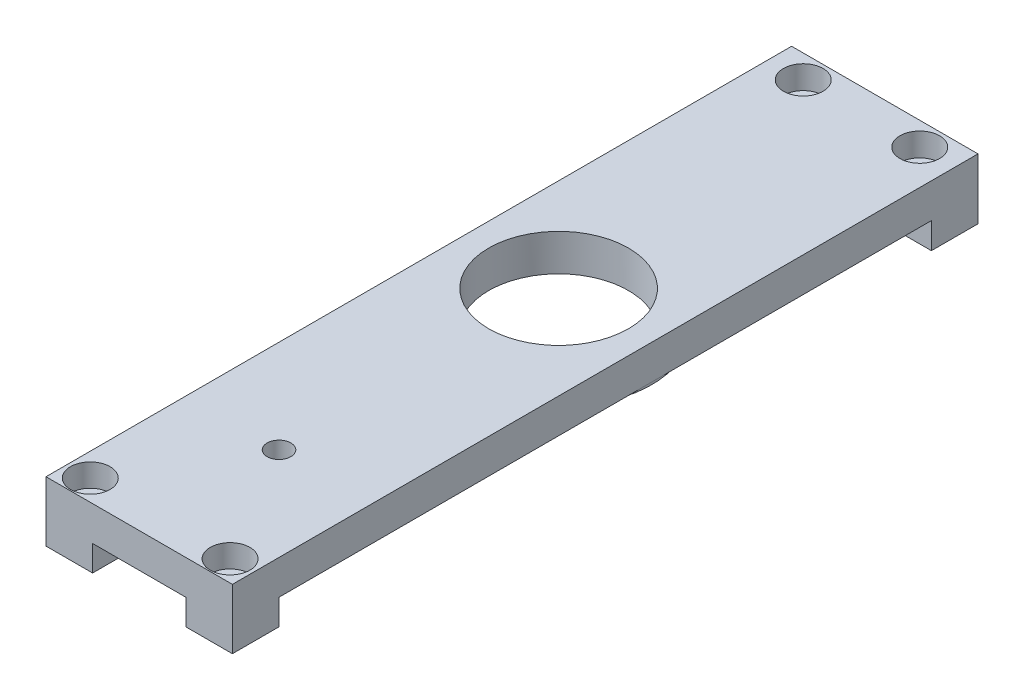
ISO-10303-21;
HEADER;
FILE_DESCRIPTION(('STEP AP214'),'2;1');
FILE_NAME('part.step','',(''),(''),'','','');
FILE_SCHEMA(('AUTOMOTIVE_DESIGN { 1 0 10303 214 1 1 1 1 }'));
ENDSEC;
DATA;
#1=APPLICATION_CONTEXT('core data for automotive mechanical design processes');
#2=APPLICATION_PROTOCOL_DEFINITION('international standard','automotive_design',2000,#1);
#3=PRODUCT_CONTEXT('',#1,'mechanical');
#4=PRODUCT('Part','Part','',(#3));
#5=PRODUCT_RELATED_PRODUCT_CATEGORY('part','',(#4));
#6=PRODUCT_DEFINITION_FORMATION('','',#4);
#7=PRODUCT_DEFINITION_CONTEXT('part definition',#1,'design');
#8=PRODUCT_DEFINITION('design','',#6,#7);
#9=PRODUCT_DEFINITION_SHAPE('','',#8);
#10=(LENGTH_UNIT() NAMED_UNIT(*) SI_UNIT(.MILLI.,.METRE.));
#11=(NAMED_UNIT(*) PLANE_ANGLE_UNIT() SI_UNIT($,.RADIAN.));
#12=(NAMED_UNIT(*) SI_UNIT($,.STERADIAN.) SOLID_ANGLE_UNIT());
#13=UNCERTAINTY_MEASURE_WITH_UNIT(LENGTH_MEASURE(1.E-05),#10,'distance_accuracy_value','');
#14=(GEOMETRIC_REPRESENTATION_CONTEXT(3) GLOBAL_UNCERTAINTY_ASSIGNED_CONTEXT((#13)) GLOBAL_UNIT_ASSIGNED_CONTEXT((#10,
#11,#12)) REPRESENTATION_CONTEXT('',''));
#15=CARTESIAN_POINT('',(0.,0.,0.));
#16=DIRECTION('',(0.,0.,1.));
#17=DIRECTION('',(1.,0.,0.));
#18=AXIS2_PLACEMENT_3D('',#15,#16,#17);
#19=CARTESIAN_POINT('',(35.,-8.60000000000001,155.5));
#20=DIRECTION('',(0.,1.,0.));
#21=DIRECTION('',(0.,0.,1.));
#22=AXIS2_PLACEMENT_3D('',#19,#20,#21);
#23=CYLINDRICAL_SURFACE('',#22,2.5);
#24=CARTESIAN_POINT('',(35.,0.100000000000003,155.5));
#25=DIRECTION('',(0.,1.,0.));
#26=DIRECTION('',(0.,0.,1.));
#27=AXIS2_PLACEMENT_3D('',#24,#25,#26);
#28=CIRCLE('',#27,2.5);
#29=CARTESIAN_POINT('',(35.,0.100000000000001,158.));
#30=VERTEX_POINT('',#29);
#31=EDGE_CURVE('E225',#30,#30,#28,.T.);
#32=CARTESIAN_POINT('',(35.,8.1,155.5));
#33=DIRECTION('',(0.,1.,0.));
#34=DIRECTION('',(0.,0.,1.));
#35=AXIS2_PLACEMENT_3D('',#32,#33,#34);
#36=CIRCLE('',#35,2.5);
#37=CARTESIAN_POINT('',(35.,8.1,158.));
#38=VERTEX_POINT('',#37);
#39=EDGE_CURVE('E47',#38,#38,#36,.F.);
#40=CARTESIAN_POINT('',(35.,0.100000000000001,158.));
#41=CARTESIAN_POINT('',(35.,0.183333333333334,158.));
#42=CARTESIAN_POINT('',(35.,0.266666666666668,158.));
#43=CARTESIAN_POINT('',(35.,0.433333333333335,158.));
#44=CARTESIAN_POINT('',(35.,0.516666666666668,158.));
#45=CARTESIAN_POINT('',(35.,0.683333333333334,158.));
#46=CARTESIAN_POINT('',(35.,0.766666666666667,158.));
#47=CARTESIAN_POINT('',(35.,0.933333333333333,158.));
#48=CARTESIAN_POINT('',(35.,1.01666666666667,158.));
#49=CARTESIAN_POINT('',(35.,1.18333333333333,158.));
#50=CARTESIAN_POINT('',(35.,1.26666666666667,158.));
#51=CARTESIAN_POINT('',(35.,1.43333333333333,158.));
#52=CARTESIAN_POINT('',(35.,1.51666666666667,158.));
#53=CARTESIAN_POINT('',(35.,1.68333333333333,158.));
#54=CARTESIAN_POINT('',(35.,1.76666666666667,158.));
#55=CARTESIAN_POINT('',(35.,1.93333333333333,158.));
#56=CARTESIAN_POINT('',(35.,2.01666666666667,158.));
#57=CARTESIAN_POINT('',(35.,2.18333333333333,158.));
#58=CARTESIAN_POINT('',(35.,2.26666666666667,158.));
#59=CARTESIAN_POINT('',(35.,2.43333333333333,158.));
#60=CARTESIAN_POINT('',(35.,2.51666666666667,158.));
#61=CARTESIAN_POINT('',(35.,2.68333333333333,158.));
#62=CARTESIAN_POINT('',(35.,2.76666666666667,158.));
#63=CARTESIAN_POINT('',(35.,2.93333333333333,158.));
#64=CARTESIAN_POINT('',(35.,3.01666666666667,158.));
#65=CARTESIAN_POINT('',(35.,3.18333333333333,158.));
#66=CARTESIAN_POINT('',(35.,3.26666666666667,158.));
#67=CARTESIAN_POINT('',(35.,3.43333333333333,158.));
#68=CARTESIAN_POINT('',(35.,3.51666666666667,158.));
#69=CARTESIAN_POINT('',(35.,3.68333333333333,158.));
#70=CARTESIAN_POINT('',(35.,3.76666666666667,158.));
#71=CARTESIAN_POINT('',(35.,3.93333333333333,158.));
#72=CARTESIAN_POINT('',(35.,4.01666666666667,158.));
#73=CARTESIAN_POINT('',(35.,4.18333333333333,158.));
#74=CARTESIAN_POINT('',(35.,4.26666666666667,158.));
#75=CARTESIAN_POINT('',(35.,4.43333333333333,158.));
#76=CARTESIAN_POINT('',(35.,4.51666666666667,158.));
#77=CARTESIAN_POINT('',(35.,4.68333333333333,158.));
#78=CARTESIAN_POINT('',(35.,4.76666666666666,158.));
#79=CARTESIAN_POINT('',(35.,4.93333333333333,158.));
#80=CARTESIAN_POINT('',(35.,5.01666666666666,158.));
#81=CARTESIAN_POINT('',(35.,5.18333333333333,158.));
#82=CARTESIAN_POINT('',(35.,5.26666666666666,158.));
#83=CARTESIAN_POINT('',(35.,5.43333333333333,158.));
#84=CARTESIAN_POINT('',(35.,5.51666666666667,158.));
#85=CARTESIAN_POINT('',(35.,5.68333333333333,158.));
#86=CARTESIAN_POINT('',(35.,5.76666666666667,158.));
#87=CARTESIAN_POINT('',(35.,5.93333333333333,158.));
#88=CARTESIAN_POINT('',(35.,6.01666666666667,158.));
#89=CARTESIAN_POINT('',(35.,6.18333333333333,158.));
#90=CARTESIAN_POINT('',(35.,6.26666666666667,158.));
#91=CARTESIAN_POINT('',(35.,6.43333333333333,158.));
#92=CARTESIAN_POINT('',(35.,6.51666666666667,158.));
#93=CARTESIAN_POINT('',(35.,6.68333333333333,158.));
#94=CARTESIAN_POINT('',(35.,6.76666666666666,158.));
#95=CARTESIAN_POINT('',(35.,6.93333333333333,158.));
#96=CARTESIAN_POINT('',(35.,7.01666666666666,158.));
#97=CARTESIAN_POINT('',(35.,7.18333333333333,158.));
#98=CARTESIAN_POINT('',(35.,7.26666666666666,158.));
#99=CARTESIAN_POINT('',(35.,7.43333333333333,158.));
#100=CARTESIAN_POINT('',(35.,7.51666666666666,158.));
#101=CARTESIAN_POINT('',(35.,7.68333333333333,158.));
#102=CARTESIAN_POINT('',(35.,7.76666666666666,158.));
#103=CARTESIAN_POINT('',(35.,7.93333333333333,158.));
#104=CARTESIAN_POINT('',(35.,8.01666666666666,158.));
#105=CARTESIAN_POINT('',(35.,8.1,158.));
#106=B_SPLINE_CURVE_WITH_KNOTS('',3,(#40,#41,#42,#43,#44,#45,#46,#47,#48,#49,#50,#51,#52,#53,
#54,#55,#56,#57,#58,#59,#60,#61,#62,#63,#64,#65,#66,#67,#68,#69,#70,#71,#72,#73,#74,#75,#76,#77,
#78,#79,#80,#81,#82,#83,#84,#85,#86,#87,#88,#89,#90,#91,#92,#93,#94,#95,#96,#97,#98,#99,#100,
#101,#102,#103,#104,#105),.UNSPECIFIED.,.F.,.F.,(4,2,2,2,2,2,2,2,2,2,2,2,2,2,2,2,2,2,2,2,2,2,2,
2,2,2,2,2,2,2,2,2,4),(0.,0.25,0.5,0.749999999999999,0.999999999999999,1.25,1.5,1.75,2.,2.25,2.5,
2.75,3.,3.25,3.5,3.75,4.,4.25,4.5,4.75,5.,5.25,5.5,5.75,6.,6.25,6.5,6.75,6.99999999999999,
7.24999999999999,7.49999999999999,7.74999999999999,7.99999999999999),.UNSPECIFIED.);
#107=EDGE_CURVE('BSEAM43',#30,#38,#106,.T.);
#108=ORIENTED_EDGE('',*,*,#31,.F.);
#109=ORIENTED_EDGE('',*,*,#39,.F.);
#110=ORIENTED_EDGE('',*,*,#107,.T.);
#111=ORIENTED_EDGE('',*,*,#107,.F.);
#112=EDGE_LOOP('',(#108,#110,#109,#111));
#113=FACE_BOUND('',#112,.T.);
#114=ADVANCED_FACE('F43',(#113),#23,.F.);
#115=CARTESIAN_POINT('',(5.,-8.60000000000001,155.5));
#116=DIRECTION('',(0.,1.,0.));
#117=DIRECTION('',(0.,0.,1.));
#118=AXIS2_PLACEMENT_3D('',#115,#116,#117);
#119=CYLINDRICAL_SURFACE('',#118,2.5);
#120=CARTESIAN_POINT('',(5.,0.100000000000003,155.5));
#121=DIRECTION('',(0.,-1.,0.));
#122=DIRECTION('',(0.,0.,-1.));
#123=AXIS2_PLACEMENT_3D('',#120,#121,#122);
#124=CIRCLE('',#123,2.5);
#125=CARTESIAN_POINT('',(5.,0.100000000000005,158.));
#126=VERTEX_POINT('',#125);
#127=EDGE_CURVE('E229',#126,#126,#124,.T.);
#128=CARTESIAN_POINT('',(5.,8.1,155.5));
#129=DIRECTION('',(0.,1.,0.));
#130=DIRECTION('',(0.,0.,1.));
#131=AXIS2_PLACEMENT_3D('',#128,#129,#130);
#132=CIRCLE('',#131,2.5);
#133=CARTESIAN_POINT('',(5.,8.1,158.));
#134=VERTEX_POINT('',#133);
#135=EDGE_CURVE('E233',#134,#134,#132,.F.);
#136=CARTESIAN_POINT('',(5.,0.100000000000005,158.));
#137=CARTESIAN_POINT('',(5.,0.183333333333338,158.));
#138=CARTESIAN_POINT('',(5.,0.266666666666671,158.));
#139=CARTESIAN_POINT('',(5.,0.433333333333338,158.));
#140=CARTESIAN_POINT('',(5.,0.516666666666672,158.));
#141=CARTESIAN_POINT('',(5.,0.683333333333338,158.));
#142=CARTESIAN_POINT('',(5.,0.766666666666671,158.));
#143=CARTESIAN_POINT('',(5.,0.933333333333337,158.));
#144=CARTESIAN_POINT('',(5.,1.01666666666667,158.));
#145=CARTESIAN_POINT('',(5.,1.18333333333334,158.));
#146=CARTESIAN_POINT('',(5.,1.26666666666667,158.));
#147=CARTESIAN_POINT('',(5.,1.43333333333334,158.));
#148=CARTESIAN_POINT('',(5.,1.51666666666667,158.));
#149=CARTESIAN_POINT('',(5.,1.68333333333334,158.));
#150=CARTESIAN_POINT('',(5.,1.76666666666667,158.));
#151=CARTESIAN_POINT('',(5.,1.93333333333334,158.));
#152=CARTESIAN_POINT('',(5.,2.01666666666667,158.));
#153=CARTESIAN_POINT('',(5.,2.18333333333334,158.));
#154=CARTESIAN_POINT('',(5.,2.26666666666667,158.));
#155=CARTESIAN_POINT('',(5.,2.43333333333334,158.));
#156=CARTESIAN_POINT('',(5.,2.51666666666667,158.));
#157=CARTESIAN_POINT('',(5.,2.68333333333334,158.));
#158=CARTESIAN_POINT('',(5.,2.76666666666667,158.));
#159=CARTESIAN_POINT('',(5.,2.93333333333333,158.));
#160=CARTESIAN_POINT('',(5.,3.01666666666667,158.));
#161=CARTESIAN_POINT('',(5.,3.18333333333334,158.));
#162=CARTESIAN_POINT('',(5.,3.26666666666667,158.));
#163=CARTESIAN_POINT('',(5.,3.43333333333333,158.));
#164=CARTESIAN_POINT('',(5.,3.51666666666667,158.));
#165=CARTESIAN_POINT('',(5.,3.68333333333333,158.));
#166=CARTESIAN_POINT('',(5.,3.76666666666667,158.));
#167=CARTESIAN_POINT('',(5.,3.93333333333333,158.));
#168=CARTESIAN_POINT('',(5.,4.01666666666667,158.));
#169=CARTESIAN_POINT('',(5.,4.18333333333334,158.));
#170=CARTESIAN_POINT('',(5.,4.26666666666667,158.));
#171=CARTESIAN_POINT('',(5.,4.43333333333334,158.));
#172=CARTESIAN_POINT('',(5.,4.51666666666667,158.));
#173=CARTESIAN_POINT('',(5.,4.68333333333333,158.));
#174=CARTESIAN_POINT('',(5.,4.76666666666667,158.));
#175=CARTESIAN_POINT('',(5.,4.93333333333333,158.));
#176=CARTESIAN_POINT('',(5.,5.01666666666667,158.));
#177=CARTESIAN_POINT('',(5.,5.18333333333333,158.));
#178=CARTESIAN_POINT('',(5.,5.26666666666667,158.));
#179=CARTESIAN_POINT('',(5.,5.43333333333333,158.));
#180=CARTESIAN_POINT('',(5.,5.51666666666667,158.));
#181=CARTESIAN_POINT('',(5.,5.68333333333333,158.));
#182=CARTESIAN_POINT('',(5.,5.76666666666667,158.));
#183=CARTESIAN_POINT('',(5.,5.93333333333333,158.));
#184=CARTESIAN_POINT('',(5.,6.01666666666667,158.));
#185=CARTESIAN_POINT('',(5.,6.18333333333333,158.));
#186=CARTESIAN_POINT('',(5.,6.26666666666667,158.));
#187=CARTESIAN_POINT('',(5.,6.43333333333333,158.));
#188=CARTESIAN_POINT('',(5.,6.51666666666667,158.));
#189=CARTESIAN_POINT('',(5.,6.68333333333333,158.));
#190=CARTESIAN_POINT('',(5.,6.76666666666667,158.));
#191=CARTESIAN_POINT('',(5.,6.93333333333333,158.));
#192=CARTESIAN_POINT('',(5.,7.01666666666666,158.));
#193=CARTESIAN_POINT('',(5.,7.18333333333333,158.));
#194=CARTESIAN_POINT('',(5.,7.26666666666666,158.));
#195=CARTESIAN_POINT('',(5.,7.43333333333333,158.));
#196=CARTESIAN_POINT('',(5.,7.51666666666666,158.));
#197=CARTESIAN_POINT('',(5.,7.68333333333333,158.));
#198=CARTESIAN_POINT('',(5.,7.76666666666666,158.));
#199=CARTESIAN_POINT('',(5.,7.93333333333333,158.));
#200=CARTESIAN_POINT('',(5.,8.01666666666666,158.));
#201=CARTESIAN_POINT('',(5.,8.1,158.));
#202=B_SPLINE_CURVE_WITH_KNOTS('',3,(#136,#137,#138,#139,#140,#141,#142,#143,#144,#145,#146,
#147,#148,#149,#150,#151,#152,#153,#154,#155,#156,#157,#158,#159,#160,#161,#162,#163,#164,#165,
#166,#167,#168,#169,#170,#171,#172,#173,#174,#175,#176,#177,#178,#179,#180,#181,#182,#183,#184,
#185,#186,#187,#188,#189,#190,#191,#192,#193,#194,#195,#196,#197,#198,#199,#200,#201),
.UNSPECIFIED.,.F.,.F.,(4,2,2,2,2,2,2,2,2,2,2,2,2,2,2,2,2,2,2,2,2,2,2,2,2,2,2,2,2,2,2,2,4),(0.,
0.25,0.5,0.749999999999999,0.999999999999999,1.25,1.5,1.75,2.,2.25,2.5,2.75,3.,3.25,3.5,3.75,4.,
4.25,4.5,4.75,5.,5.25,5.49999999999999,5.74999999999999,5.99999999999999,6.25,6.5,
6.74999999999999,6.99999999999999,7.24999999999999,7.49999999999999,7.74999999999999,
7.99999999999999),.UNSPECIFIED.);
#203=EDGE_CURVE('BSEAM398',#126,#134,#202,.T.);
#204=ORIENTED_EDGE('',*,*,#127,.T.);
#205=ORIENTED_EDGE('',*,*,#135,.F.);
#206=ORIENTED_EDGE('',*,*,#203,.T.);
#207=ORIENTED_EDGE('',*,*,#203,.F.);
#208=EDGE_LOOP('',(#204,#206,#205,#207));
#209=FACE_BOUND('',#208,.T.);
#210=ADVANCED_FACE('F398',(#209),#119,.F.);
#211=CARTESIAN_POINT('',(0.,5.6,160.));
#212=DIRECTION('',(0.,1.,0.));
#213=DIRECTION('',(0.,0.,1.));
#214=AXIS2_PLACEMENT_3D('',#211,#212,#213);
#215=PLANE('',#214);
#216=CARTESIAN_POINT('',(20.,5.6,130.));
#217=DIRECTION('',(0.,-1.,0.));
#218=DIRECTION('',(0.,0.,-1.));
#219=AXIS2_PLACEMENT_3D('',#216,#217,#218);
#220=CIRCLE('',#219,2.54999999999999);
#221=CARTESIAN_POINT('',(20.,5.6,127.45));
#222=VERTEX_POINT('',#221);
#223=EDGE_CURVE('E330',#222,#222,#220,.T.);
#224=ORIENTED_EDGE('',*,*,#223,.F.);
#225=EDGE_LOOP('',(#224));
#226=FACE_BOUND('',#225,.T.);
#227=DIRECTION('',(0.,0.,-1.));
#228=VECTOR('',#227,1.);
#229=CARTESIAN_POINT('',(30.,5.6,160.));
#230=LINE('',#229,#228);
#231=CARTESIAN_POINT('',(30.,5.6,160.));
#232=VERTEX_POINT('',#231);
#233=CARTESIAN_POINT('',(30.,5.6,150.));
#234=VERTEX_POINT('',#233);
#235=EDGE_CURVE('E155',#232,#234,#230,.T.);
#236=ORIENTED_EDGE('',*,*,#235,.F.);
#237=DIRECTION('',(1.,0.,0.));
#238=VECTOR('',#237,1.);
#239=CARTESIAN_POINT('',(0.,5.6,160.));
#240=LINE('',#239,#238);
#241=CARTESIAN_POINT('',(10.,5.6,160.));
#242=VERTEX_POINT('',#241);
#243=EDGE_CURVE('E352',#242,#232,#240,.T.);
#244=ORIENTED_EDGE('',*,*,#243,.F.);
#245=DIRECTION('',(0.,0.,1.));
#246=VECTOR('',#245,1.);
#247=CARTESIAN_POINT('',(10.,5.6,160.));
#248=LINE('',#247,#246);
#249=CARTESIAN_POINT('',(10.,5.6,150.));
#250=VERTEX_POINT('',#249);
#251=EDGE_CURVE('E281',#250,#242,#248,.T.);
#252=ORIENTED_EDGE('',*,*,#251,.F.);
#253=DIRECTION('',(1.,0.,0.));
#254=VECTOR('',#253,1.);
#255=CARTESIAN_POINT('',(0.,5.6,150.));
#256=LINE('',#255,#254);
#257=CARTESIAN_POINT('',(0.,5.6,150.));
#258=VERTEX_POINT('',#257);
#259=EDGE_CURVE('E265',#258,#250,#256,.T.);
#260=ORIENTED_EDGE('',*,*,#259,.F.);
#261=DIRECTION('',(0.,0.,-1.));
#262=VECTOR('',#261,1.);
#263=CARTESIAN_POINT('',(0.,5.6,160.));
#264=LINE('',#263,#262);
#265=CARTESIAN_POINT('',(0.,5.6,70.));
#266=VERTEX_POINT('',#265);
#267=EDGE_CURVE('E173',#258,#266,#264,.T.);
#268=ORIENTED_EDGE('',*,*,#267,.T.);
#269=CARTESIAN_POINT('',(20.,5.6,70.));
#270=DIRECTION('',(0.,-1.,0.));
#271=DIRECTION('',(0.,0.,-1.));
#272=AXIS2_PLACEMENT_3D('',#269,#270,#271);
#273=CIRCLE('',#272,20.);
#274=CARTESIAN_POINT('',(40.,5.6,70.));
#275=VERTEX_POINT('',#274);
#276=EDGE_CURVE('E165',#275,#266,#273,.T.);
#277=ORIENTED_EDGE('',*,*,#276,.F.);
#278=DIRECTION('',(0.,0.,-1.));
#279=VECTOR('',#278,1.);
#280=CARTESIAN_POINT('',(40.,5.6,160.));
#281=LINE('',#280,#279);
#282=CARTESIAN_POINT('',(40.,5.6,150.));
#283=VERTEX_POINT('',#282);
#284=EDGE_CURVE('E69',#283,#275,#281,.T.);
#285=ORIENTED_EDGE('',*,*,#284,.F.);
#286=DIRECTION('',(1.,0.,0.));
#287=VECTOR('',#286,1.);
#288=CARTESIAN_POINT('',(40.,5.6,150.));
#289=LINE('',#288,#287);
#290=EDGE_CURVE('E145',#234,#283,#289,.T.);
#291=ORIENTED_EDGE('',*,*,#290,.F.);
#292=EDGE_LOOP('',(#236,#244,#252,#260,#268,#277,#285,#291));
#293=FACE_BOUND('',#292,.T.);
#294=ADVANCED_FACE('F163',(#226,#293),#215,.F.);
#295=CARTESIAN_POINT('',(32.5,17.,5.));
#296=DIRECTION('',(0.,-1.,0.));
#297=DIRECTION('',(0.,0.,-1.));
#298=AXIS2_PLACEMENT_3D('',#295,#296,#297);
#299=CYLINDRICAL_SURFACE('',#298,2.5);
#300=CARTESIAN_POINT('',(32.5,0.,5.));
#301=DIRECTION('',(0.,-1.,0.));
#302=DIRECTION('',(0.,0.,-1.));
#303=AXIS2_PLACEMENT_3D('',#300,#301,#302);
#304=CIRCLE('',#303,2.5);
#305=CARTESIAN_POINT('',(32.5,0.,2.5));
#306=VERTEX_POINT('',#305);
#307=EDGE_CURVE('E224',#306,#306,#304,.T.);
#308=ORIENTED_EDGE('',*,*,#307,.T.);
#309=EDGE_LOOP('',(#308));
#310=FACE_BOUND('',#309,.T.);
#311=CARTESIAN_POINT('',(32.5,8.,5.));
#312=DIRECTION('',(0.,1.,0.));
#313=DIRECTION('',(0.,0.,1.));
#314=AXIS2_PLACEMENT_3D('',#311,#312,#313);
#315=CIRCLE('',#314,2.5);
#316=CARTESIAN_POINT('',(32.5,8.,7.5));
#317=VERTEX_POINT('',#316);
#318=EDGE_CURVE('E219',#317,#317,#315,.F.);
#319=ORIENTED_EDGE('',*,*,#318,.F.);
#320=EDGE_LOOP('',(#319));
#321=FACE_BOUND('',#320,.T.);
#322=ADVANCED_FACE('F446',(#310,#321),#299,.F.);
#323=CARTESIAN_POINT('',(7.5,17.,5.));
#324=DIRECTION('',(0.,-1.,0.));
#325=DIRECTION('',(0.,0.,-1.));
#326=AXIS2_PLACEMENT_3D('',#323,#324,#325);
#327=CYLINDRICAL_SURFACE('',#326,2.5);
#328=CARTESIAN_POINT('',(7.5,0.,5.));
#329=DIRECTION('',(0.,-1.,0.));
#330=DIRECTION('',(0.,0.,-1.));
#331=AXIS2_PLACEMENT_3D('',#328,#329,#330);
#332=CIRCLE('',#331,2.5);
#333=CARTESIAN_POINT('',(7.5,0.,2.5));
#334=VERTEX_POINT('',#333);
#335=EDGE_CURVE('E319',#334,#334,#332,.T.);
#336=ORIENTED_EDGE('',*,*,#335,.T.);
#337=EDGE_LOOP('',(#336));
#338=FACE_BOUND('',#337,.T.);
#339=CARTESIAN_POINT('',(7.5,8.,5.));
#340=DIRECTION('',(0.,1.,0.));
#341=DIRECTION('',(0.,0.,1.));
#342=AXIS2_PLACEMENT_3D('',#339,#340,#341);
#343=CIRCLE('',#342,2.5);
#344=CARTESIAN_POINT('',(7.5,8.,7.5));
#345=VERTEX_POINT('',#344);
#346=EDGE_CURVE('E215',#345,#345,#343,.F.);
#347=ORIENTED_EDGE('',*,*,#346,.F.);
#348=EDGE_LOOP('',(#347));
#349=FACE_BOUND('',#348,.T.);
#350=ADVANCED_FACE('F442',(#338,#349),#327,.F.);
#351=EDGE_CURVE('E338',#266,#275,#273,.T.);
#352=ORIENTED_EDGE('',*,*,#351,.F.);
#353=CARTESIAN_POINT('',(0.,5.6,10.));
#354=VERTEX_POINT('',#353);
#355=EDGE_CURVE('E168',#266,#354,#264,.T.);
#356=ORIENTED_EDGE('',*,*,#355,.T.);
#357=DIRECTION('',(1.,0.,0.));
#358=VECTOR('',#357,1.);
#359=CARTESIAN_POINT('',(0.,5.6,10.));
#360=LINE('',#359,#358);
#361=CARTESIAN_POINT('',(40.,5.6,10.));
#362=VERTEX_POINT('',#361);
#363=EDGE_CURVE('E177',#354,#362,#360,.T.);
#364=ORIENTED_EDGE('',*,*,#363,.T.);
#365=EDGE_CURVE('E169',#275,#362,#281,.T.);
#366=ORIENTED_EDGE('',*,*,#365,.F.);
#367=EDGE_LOOP('',(#352,#356,#364,#366));
#368=FACE_BOUND('',#367,.T.);
#369=ADVANCED_FACE('F445',(#368),#215,.F.);
#370=CARTESIAN_POINT('',(0.,0.,10.));
#371=DIRECTION('',(0.,0.,-1.));
#372=DIRECTION('',(-1.,0.,0.));
#373=AXIS2_PLACEMENT_3D('',#370,#371,#372);
#374=PLANE('',#373);
#375=ORIENTED_EDGE('',*,*,#363,.F.);
#376=DIRECTION('',(0.,-1.,0.));
#377=VECTOR('',#376,1.);
#378=CARTESIAN_POINT('',(0.,0.,10.));
#379=LINE('',#378,#377);
#380=CARTESIAN_POINT('',(0.,0.,10.));
#381=VERTEX_POINT('',#380);
#382=EDGE_CURVE('E182',#354,#381,#379,.T.);
#383=ORIENTED_EDGE('',*,*,#382,.T.);
#384=DIRECTION('',(1.,0.,0.));
#385=VECTOR('',#384,1.);
#386=CARTESIAN_POINT('',(0.,0.,10.));
#387=LINE('',#386,#385);
#388=CARTESIAN_POINT('',(40.,0.,10.));
#389=VERTEX_POINT('',#388);
#390=EDGE_CURVE('E185',#381,#389,#387,.T.);
#391=ORIENTED_EDGE('',*,*,#390,.T.);
#392=DIRECTION('',(0.,1.,0.));
#393=VECTOR('',#392,1.);
#394=CARTESIAN_POINT('',(40.,0.,10.));
#395=LINE('',#394,#393);
#396=EDGE_CURVE('E189',#389,#362,#395,.T.);
#397=ORIENTED_EDGE('',*,*,#396,.T.);
#398=EDGE_LOOP('',(#375,#383,#391,#397));
#399=FACE_BOUND('',#398,.T.);
#400=ADVANCED_FACE('F472',(#399),#374,.F.);
#401=CARTESIAN_POINT('',(0.,0.,10.));
#402=DIRECTION('',(1.,0.,0.));
#403=DIRECTION('',(0.,0.,-1.));
#404=AXIS2_PLACEMENT_3D('',#401,#402,#403);
#405=PLANE('',#404);
#406=DIRECTION('',(0.,-1.,0.));
#407=VECTOR('',#406,1.);
#408=CARTESIAN_POINT('',(0.,0.,0.));
#409=LINE('',#408,#407);
#410=CARTESIAN_POINT('',(0.,13.,0.));
#411=VERTEX_POINT('',#410);
#412=CARTESIAN_POINT('',(0.,0.,0.));
#413=VERTEX_POINT('',#412);
#414=EDGE_CURVE('E181',#411,#413,#409,.T.);
#415=ORIENTED_EDGE('',*,*,#414,.T.);
#416=DIRECTION('',(0.,0.,-1.));
#417=VECTOR('',#416,1.);
#418=CARTESIAN_POINT('',(0.,0.,10.));
#419=LINE('',#418,#417);
#420=EDGE_CURVE('E11',#381,#413,#419,.T.);
#421=ORIENTED_EDGE('',*,*,#420,.F.);
#422=ORIENTED_EDGE('',*,*,#382,.F.);
#423=ORIENTED_EDGE('',*,*,#355,.F.);
#424=ORIENTED_EDGE('',*,*,#267,.F.);
#425=DIRECTION('',(0.,1.,0.));
#426=VECTOR('',#425,1.);
#427=CARTESIAN_POINT('',(0.,0.100000000000002,150.));
#428=LINE('',#427,#426);
#429=CARTESIAN_POINT('',(0.,0.100000000000002,150.));
#430=VERTEX_POINT('',#429);
#431=EDGE_CURVE('E301',#430,#258,#428,.T.);
#432=ORIENTED_EDGE('',*,*,#431,.F.);
#433=DIRECTION('',(0.,0.,-1.));
#434=VECTOR('',#433,1.);
#435=CARTESIAN_POINT('',(0.,0.100000000000002,160.));
#436=LINE('',#435,#434);
#437=CARTESIAN_POINT('',(0.,0.100000000000002,160.));
#438=VERTEX_POINT('',#437);
#439=EDGE_CURVE('E276',#438,#430,#436,.T.);
#440=ORIENTED_EDGE('',*,*,#439,.F.);
#441=DIRECTION('',(0.,-1.,0.));
#442=VECTOR('',#441,1.);
#443=CARTESIAN_POINT('',(0.,13.,160.));
#444=LINE('',#443,#442);
#445=CARTESIAN_POINT('',(0.,13.,160.));
#446=VERTEX_POINT('',#445);
#447=EDGE_CURVE('E349',#446,#438,#444,.T.);
#448=ORIENTED_EDGE('',*,*,#447,.F.);
#449=DIRECTION('',(0.,0.,-1.));
#450=VECTOR('',#449,1.);
#451=CARTESIAN_POINT('',(0.,13.,10.));
#452=LINE('',#451,#450);
#453=EDGE_CURVE('E193',#446,#411,#452,.T.);
#454=ORIENTED_EDGE('',*,*,#453,.T.);
#455=EDGE_LOOP('',(#415,#421,#422,#423,#424,#432,#440,#448,#454));
#456=FACE_BOUND('',#455,.T.);
#457=ADVANCED_FACE('F45',(#456),#405,.F.);
#458=CARTESIAN_POINT('',(0.,0.,10.));
#459=DIRECTION('',(0.,1.,0.));
#460=DIRECTION('',(0.,0.,1.));
#461=AXIS2_PLACEMENT_3D('',#458,#459,#460);
#462=PLANE('',#461);
#463=ORIENTED_EDGE('',*,*,#335,.F.);
#464=EDGE_LOOP('',(#463));
#465=FACE_BOUND('',#464,.T.);
#466=ORIENTED_EDGE('',*,*,#307,.F.);
#467=EDGE_LOOP('',(#466));
#468=FACE_BOUND('',#467,.T.);
#469=DIRECTION('',(1.,0.,0.));
#470=VECTOR('',#469,1.);
#471=CARTESIAN_POINT('',(0.,0.,0.));
#472=LINE('',#471,#470);
#473=CARTESIAN_POINT('',(40.,0.,0.));
#474=VERTEX_POINT('',#473);
#475=EDGE_CURVE('E197',#413,#474,#472,.T.);
#476=ORIENTED_EDGE('',*,*,#475,.T.);
#477=DIRECTION('',(0.,0.,-1.));
#478=VECTOR('',#477,1.);
#479=CARTESIAN_POINT('',(40.,0.,10.));
#480=LINE('',#479,#478);
#481=EDGE_CURVE('E53',#389,#474,#480,.T.);
#482=ORIENTED_EDGE('',*,*,#481,.F.);
#483=ORIENTED_EDGE('',*,*,#390,.F.);
#484=ORIENTED_EDGE('',*,*,#420,.T.);
#485=EDGE_LOOP('',(#476,#482,#483,#484));
#486=FACE_BOUND('',#485,.T.);
#487=ADVANCED_FACE('F484',(#465,#468,#486),#462,.F.);
#488=CARTESIAN_POINT('',(40.,0.,10.));
#489=DIRECTION('',(-1.,0.,0.));
#490=DIRECTION('',(0.,0.,1.));
#491=AXIS2_PLACEMENT_3D('',#488,#489,#490);
#492=PLANE('',#491);
#493=DIRECTION('',(0.,1.,0.));
#494=VECTOR('',#493,1.);
#495=CARTESIAN_POINT('',(40.,0.,0.));
#496=LINE('',#495,#494);
#497=CARTESIAN_POINT('',(40.,13.,0.));
#498=VERTEX_POINT('',#497);
#499=EDGE_CURVE('E200',#474,#498,#496,.T.);
#500=ORIENTED_EDGE('',*,*,#499,.T.);
#501=DIRECTION('',(0.,0.,-1.));
#502=VECTOR('',#501,1.);
#503=CARTESIAN_POINT('',(40.,13.,10.));
#504=LINE('',#503,#502);
#505=CARTESIAN_POINT('',(40.,13.,160.));
#506=VERTEX_POINT('',#505);
#507=EDGE_CURVE('E208',#506,#498,#504,.T.);
#508=ORIENTED_EDGE('',*,*,#507,.F.);
#509=DIRECTION('',(0.,1.,0.));
#510=VECTOR('',#509,1.);
#511=CARTESIAN_POINT('',(40.,13.,160.));
#512=LINE('',#511,#510);
#513=CARTESIAN_POINT('',(40.,0.100000000000002,160.));
#514=VERTEX_POINT('',#513);
#515=EDGE_CURVE('E355',#514,#506,#512,.T.);
#516=ORIENTED_EDGE('',*,*,#515,.F.);
#517=DIRECTION('',(0.,0.,1.));
#518=VECTOR('',#517,1.);
#519=CARTESIAN_POINT('',(40.,0.100000000000002,160.));
#520=LINE('',#519,#518);
#521=CARTESIAN_POINT('',(40.,0.100000000000002,150.));
#522=VERTEX_POINT('',#521);
#523=EDGE_CURVE('E156',#522,#514,#520,.T.);
#524=ORIENTED_EDGE('',*,*,#523,.F.);
#525=DIRECTION('',(0.,1.,0.));
#526=VECTOR('',#525,1.);
#527=CARTESIAN_POINT('',(40.,0.100000000000002,150.));
#528=LINE('',#527,#526);
#529=EDGE_CURVE('E148',#522,#283,#528,.T.);
#530=ORIENTED_EDGE('',*,*,#529,.T.);
#531=ORIENTED_EDGE('',*,*,#284,.T.);
#532=ORIENTED_EDGE('',*,*,#365,.T.);
#533=ORIENTED_EDGE('',*,*,#396,.F.);
#534=ORIENTED_EDGE('',*,*,#481,.T.);
#535=EDGE_LOOP('',(#500,#508,#516,#524,#530,#531,#532,#533,#534));
#536=FACE_BOUND('',#535,.T.);
#537=ADVANCED_FACE('F158',(#536),#492,.F.);
#538=CARTESIAN_POINT('',(0.,13.,10.));
#539=DIRECTION('',(0.,-1.,0.));
#540=DIRECTION('',(0.,0.,-1.));
#541=AXIS2_PLACEMENT_3D('',#538,#539,#540);
#542=PLANE('',#541);
#543=CARTESIAN_POINT('',(5.,13.,155.5));
#544=DIRECTION('',(0.,1.,0.));
#545=DIRECTION('',(0.,0.,1.));
#546=AXIS2_PLACEMENT_3D('',#543,#544,#545);
#547=CIRCLE('',#546,4.25);
#548=CARTESIAN_POINT('',(5.,13.,159.75));
#549=VERTEX_POINT('',#548);
#550=EDGE_CURVE('E243',#549,#549,#547,.T.);
#551=ORIENTED_EDGE('',*,*,#550,.F.);
#552=EDGE_LOOP('',(#551));
#553=FACE_BOUND('',#552,.T.);
#554=CARTESIAN_POINT('',(35.,13.,155.5));
#555=DIRECTION('',(0.,1.,0.));
#556=DIRECTION('',(0.,0.,1.));
#557=AXIS2_PLACEMENT_3D('',#554,#555,#556);
#558=CIRCLE('',#557,4.25000000000001);
#559=CARTESIAN_POINT('',(35.,13.,159.75));
#560=VERTEX_POINT('',#559);
#561=EDGE_CURVE('E249',#560,#560,#558,.T.);
#562=ORIENTED_EDGE('',*,*,#561,.F.);
#563=EDGE_LOOP('',(#562));
#564=FACE_BOUND('',#563,.T.);
#565=CARTESIAN_POINT('',(7.5,13.,5.));
#566=DIRECTION('',(0.,1.,0.));
#567=DIRECTION('',(0.,0.,1.));
#568=AXIS2_PLACEMENT_3D('',#565,#566,#567);
#569=CIRCLE('',#568,4.25);
#570=CARTESIAN_POINT('',(7.5,13.,9.25));
#571=VERTEX_POINT('',#570);
#572=EDGE_CURVE('E308',#571,#571,#569,.T.);
#573=ORIENTED_EDGE('',*,*,#572,.F.);
#574=EDGE_LOOP('',(#573));
#575=FACE_BOUND('',#574,.T.);
#576=CARTESIAN_POINT('',(32.5,13.,5.));
#577=DIRECTION('',(0.,1.,0.));
#578=DIRECTION('',(0.,0.,1.));
#579=AXIS2_PLACEMENT_3D('',#576,#577,#578);
#580=CIRCLE('',#579,4.25000000000001);
#581=CARTESIAN_POINT('',(32.5,13.,9.25000000000001));
#582=VERTEX_POINT('',#581);
#583=EDGE_CURVE('E312',#582,#582,#580,.T.);
#584=ORIENTED_EDGE('',*,*,#583,.F.);
#585=EDGE_LOOP('',(#584));
#586=FACE_BOUND('',#585,.T.);
#587=CARTESIAN_POINT('',(20.,13.,130.));
#588=DIRECTION('',(0.,-1.,0.));
#589=DIRECTION('',(0.,0.,-1.));
#590=AXIS2_PLACEMENT_3D('',#587,#588,#589);
#591=CIRCLE('',#590,2.54999999999999);
#592=CARTESIAN_POINT('',(20.,13.,127.45));
#593=VERTEX_POINT('',#592);
#594=EDGE_CURVE('E334',#593,#593,#591,.T.);
#595=ORIENTED_EDGE('',*,*,#594,.T.);
#596=EDGE_LOOP('',(#595));
#597=FACE_BOUND('',#596,.T.);
#598=CARTESIAN_POINT('',(20.,13.,70.));
#599=DIRECTION('',(0.,-1.,0.));
#600=DIRECTION('',(0.,0.,-1.));
#601=AXIS2_PLACEMENT_3D('',#598,#599,#600);
#602=CIRCLE('',#601,15.);
#603=CARTESIAN_POINT('',(20.,13.,55.));
#604=VERTEX_POINT('',#603);
#605=EDGE_CURVE('E343',#604,#604,#602,.F.);
#606=ORIENTED_EDGE('',*,*,#605,.F.);
#607=EDGE_LOOP('',(#606));
#608=FACE_BOUND('',#607,.T.);
#609=DIRECTION('',(-1.,0.,0.));
#610=VECTOR('',#609,1.);
#611=CARTESIAN_POINT('',(0.,13.,0.));
#612=LINE('',#611,#610);
#613=EDGE_CURVE('E186',#498,#411,#612,.T.);
#614=ORIENTED_EDGE('',*,*,#613,.T.);
#615=ORIENTED_EDGE('',*,*,#453,.F.);
#616=DIRECTION('',(-1.,0.,0.));
#617=VECTOR('',#616,1.);
#618=CARTESIAN_POINT('',(0.,13.,160.));
#619=LINE('',#618,#617);
#620=EDGE_CURVE('E175',#506,#446,#619,.T.);
#621=ORIENTED_EDGE('',*,*,#620,.F.);
#622=ORIENTED_EDGE('',*,*,#507,.T.);
#623=EDGE_LOOP('',(#614,#615,#621,#622));
#624=FACE_BOUND('',#623,.T.);
#625=ADVANCED_FACE('F478',(#553,#564,#575,#586,#597,#608,#624),#542,.F.);
#626=CARTESIAN_POINT('',(0.,0.,0.));
#627=DIRECTION('',(0.,0.,-1.));
#628=DIRECTION('',(-1.,0.,0.));
#629=AXIS2_PLACEMENT_3D('',#626,#627,#628);
#630=PLANE('',#629);
#631=ORIENTED_EDGE('',*,*,#414,.F.);
#632=ORIENTED_EDGE('',*,*,#613,.F.);
#633=ORIENTED_EDGE('',*,*,#499,.F.);
#634=ORIENTED_EDGE('',*,*,#475,.F.);
#635=EDGE_LOOP('',(#631,#632,#633,#634));
#636=FACE_BOUND('',#635,.T.);
#637=ADVANCED_FACE('F468',(#636),#630,.T.);
#638=CARTESIAN_POINT('',(0.,0.,160.));
#639=DIRECTION('',(0.,0.,1.));
#640=DIRECTION('',(1.,0.,0.));
#641=AXIS2_PLACEMENT_3D('',#638,#639,#640);
#642=PLANE('',#641);
#643=ORIENTED_EDGE('',*,*,#447,.T.);
#644=DIRECTION('',(-1.,0.,0.));
#645=VECTOR('',#644,1.);
#646=CARTESIAN_POINT('',(0.,0.100000000000002,160.));
#647=LINE('',#646,#645);
#648=CARTESIAN_POINT('',(10.,0.100000000000002,160.));
#649=VERTEX_POINT('',#648);
#650=EDGE_CURVE('E287',#649,#438,#647,.T.);
#651=ORIENTED_EDGE('',*,*,#650,.F.);
#652=DIRECTION('',(0.,1.,0.));
#653=VECTOR('',#652,1.);
#654=CARTESIAN_POINT('',(10.,0.100000000000002,160.));
#655=LINE('',#654,#653);
#656=EDGE_CURVE('E61',#649,#242,#655,.T.);
#657=ORIENTED_EDGE('',*,*,#656,.T.);
#658=ORIENTED_EDGE('',*,*,#243,.T.);
#659=DIRECTION('',(0.,1.,0.));
#660=VECTOR('',#659,1.);
#661=CARTESIAN_POINT('',(30.,0.100000000000002,160.));
#662=LINE('',#661,#660);
#663=CARTESIAN_POINT('',(30.,0.100000000000002,160.));
#664=VERTEX_POINT('',#663);
#665=EDGE_CURVE('E232',#664,#232,#662,.T.);
#666=ORIENTED_EDGE('',*,*,#665,.F.);
#667=DIRECTION('',(-1.,0.,0.));
#668=VECTOR('',#667,1.);
#669=CARTESIAN_POINT('',(40.,0.100000000000002,160.));
#670=LINE('',#669,#668);
#671=EDGE_CURVE('E271',#514,#664,#670,.T.);
#672=ORIENTED_EDGE('',*,*,#671,.F.);
#673=ORIENTED_EDGE('',*,*,#515,.T.);
#674=ORIENTED_EDGE('',*,*,#620,.T.);
#675=EDGE_LOOP('',(#643,#651,#657,#658,#666,#672,#673,#674));
#676=FACE_BOUND('',#675,.T.);
#677=ADVANCED_FACE('F362',(#676),#642,.T.);
#678=CARTESIAN_POINT('',(20.,0.,70.));
#679=DIRECTION('',(0.,1.,0.));
#680=DIRECTION('',(0.,0.,1.));
#681=AXIS2_PLACEMENT_3D('',#678,#679,#680);
#682=CYLINDRICAL_SURFACE('',#681,15.);
#683=ORIENTED_EDGE('',*,*,#605,.T.);
#684=EDGE_LOOP('',(#683));
#685=FACE_BOUND('',#684,.T.);
#686=CARTESIAN_POINT('',(20.,5.1,70.));
#687=DIRECTION('',(0.,1.,0.));
#688=DIRECTION('',(0.,0.,1.));
#689=AXIS2_PLACEMENT_3D('',#686,#687,#688);
#690=CIRCLE('',#689,15.);
#691=CARTESIAN_POINT('',(20.,5.1,85.));
#692=VERTEX_POINT('',#691);
#693=EDGE_CURVE('E323',#692,#692,#690,.T.);
#694=ORIENTED_EDGE('',*,*,#693,.F.);
#695=EDGE_LOOP('',(#694));
#696=FACE_BOUND('',#695,.T.);
#697=ADVANCED_FACE('F461',(#685,#696),#682,.F.);
#698=CARTESIAN_POINT('',(20.,5.1,70.));
#699=DIRECTION('',(0.,1.,0.));
#700=DIRECTION('',(0.,0.,1.));
#701=AXIS2_PLACEMENT_3D('',#698,#699,#700);
#702=CYLINDRICAL_SURFACE('',#701,20.);
#703=CARTESIAN_POINT('',(20.,5.1,70.));
#704=DIRECTION('',(0.,-1.,0.));
#705=DIRECTION('',(0.,0.,-1.));
#706=AXIS2_PLACEMENT_3D('',#703,#704,#705);
#707=CIRCLE('',#706,20.);
#708=CARTESIAN_POINT('',(20.,5.1,50.));
#709=VERTEX_POINT('',#708);
#710=EDGE_CURVE('E339',#709,#709,#707,.T.);
#711=ORIENTED_EDGE('',*,*,#710,.F.);
#712=EDGE_LOOP('',(#711));
#713=FACE_BOUND('',#712,.T.);
#714=ORIENTED_EDGE('',*,*,#276,.T.);
#715=ORIENTED_EDGE('',*,*,#351,.T.);
#716=EDGE_LOOP('',(#714,#715));
#717=FACE_BOUND('',#716,.T.);
#718=ADVANCED_FACE('F457',(#713,#717),#702,.T.);
#719=CARTESIAN_POINT('',(20.,5.1,70.));
#720=DIRECTION('',(0.,-1.,0.));
#721=DIRECTION('',(0.,0.,-1.));
#722=AXIS2_PLACEMENT_3D('',#719,#720,#721);
#723=PLANE('',#722);
#724=ORIENTED_EDGE('',*,*,#693,.T.);
#725=EDGE_LOOP('',(#724));
#726=FACE_BOUND('',#725,.T.);
#727=ORIENTED_EDGE('',*,*,#710,.T.);
#728=EDGE_LOOP('',(#727));
#729=FACE_BOUND('',#728,.T.);
#730=ADVANCED_FACE('F453',(#726,#729),#723,.T.);
#731=CARTESIAN_POINT('',(20.,155.6,130.));
#732=DIRECTION('',(0.,-1.,0.));
#733=DIRECTION('',(0.,0.,-1.));
#734=AXIS2_PLACEMENT_3D('',#731,#732,#733);
#735=CYLINDRICAL_SURFACE('',#734,2.54999999999999);
#736=ORIENTED_EDGE('',*,*,#223,.T.);
#737=EDGE_LOOP('',(#736));
#738=FACE_BOUND('',#737,.T.);
#739=ORIENTED_EDGE('',*,*,#594,.F.);
#740=EDGE_LOOP('',(#739));
#741=FACE_BOUND('',#740,.T.);
#742=ADVANCED_FACE('F430',(#738,#741),#735,.F.);
#743=CARTESIAN_POINT('',(7.5,8.,5.));
#744=DIRECTION('',(0.,1.,0.));
#745=DIRECTION('',(0.,0.,1.));
#746=AXIS2_PLACEMENT_3D('',#743,#744,#745);
#747=PLANE('',#746);
#748=CARTESIAN_POINT('',(7.5,8.,5.));
#749=DIRECTION('',(0.,1.,0.));
#750=DIRECTION('',(0.,0.,1.));
#751=AXIS2_PLACEMENT_3D('',#748,#749,#750);
#752=CIRCLE('',#751,4.25);
#753=CARTESIAN_POINT('',(7.5,8.,9.25));
#754=VERTEX_POINT('',#753);
#755=EDGE_CURVE('E220',#754,#754,#752,.T.);
#756=ORIENTED_EDGE('',*,*,#755,.T.);
#757=EDGE_LOOP('',(#756));
#758=FACE_BOUND('',#757,.T.);
#759=ORIENTED_EDGE('',*,*,#346,.T.);
#760=EDGE_LOOP('',(#759));
#761=FACE_BOUND('',#760,.T.);
#762=ADVANCED_FACE('F426',(#758,#761),#747,.T.);
#763=CARTESIAN_POINT('',(7.5,8.,5.));
#764=DIRECTION('',(0.,1.,0.));
#765=DIRECTION('',(0.,0.,1.));
#766=AXIS2_PLACEMENT_3D('',#763,#764,#765);
#767=CYLINDRICAL_SURFACE('',#766,4.25);
#768=ORIENTED_EDGE('',*,*,#755,.F.);
#769=EDGE_LOOP('',(#768));
#770=FACE_BOUND('',#769,.T.);
#771=ORIENTED_EDGE('',*,*,#572,.T.);
#772=EDGE_LOOP('',(#771));
#773=FACE_BOUND('',#772,.T.);
#774=ADVANCED_FACE('F429',(#770,#773),#767,.F.);
#775=CARTESIAN_POINT('',(32.5,8.,5.));
#776=DIRECTION('',(0.,1.,0.));
#777=DIRECTION('',(0.,0.,1.));
#778=AXIS2_PLACEMENT_3D('',#775,#776,#777);
#779=PLANE('',#778);
#780=CARTESIAN_POINT('',(32.5,8.,5.));
#781=DIRECTION('',(0.,1.,0.));
#782=DIRECTION('',(0.,0.,1.));
#783=AXIS2_PLACEMENT_3D('',#780,#781,#782);
#784=CIRCLE('',#783,4.25000000000001);
#785=CARTESIAN_POINT('',(32.5,8.,9.25000000000001));
#786=VERTEX_POINT('',#785);
#787=EDGE_CURVE('E304',#786,#786,#784,.T.);
#788=ORIENTED_EDGE('',*,*,#787,.T.);
#789=EDGE_LOOP('',(#788));
#790=FACE_BOUND('',#789,.T.);
#791=ORIENTED_EDGE('',*,*,#318,.T.);
#792=EDGE_LOOP('',(#791));
#793=FACE_BOUND('',#792,.T.);
#794=ADVANCED_FACE('F434',(#790,#793),#779,.T.);
#795=CARTESIAN_POINT('',(32.5,8.,5.));
#796=DIRECTION('',(0.,1.,0.));
#797=DIRECTION('',(0.,0.,1.));
#798=AXIS2_PLACEMENT_3D('',#795,#796,#797);
#799=CYLINDRICAL_SURFACE('',#798,4.25000000000001);
#800=ORIENTED_EDGE('',*,*,#787,.F.);
#801=EDGE_LOOP('',(#800));
#802=FACE_BOUND('',#801,.T.);
#803=ORIENTED_EDGE('',*,*,#583,.T.);
#804=EDGE_LOOP('',(#803));
#805=FACE_BOUND('',#804,.T.);
#806=ADVANCED_FACE('F424',(#802,#805),#799,.F.);
#807=CARTESIAN_POINT('',(0.,0.100000000000002,150.));
#808=DIRECTION('',(0.,0.,1.));
#809=DIRECTION('',(1.,0.,0.));
#810=AXIS2_PLACEMENT_3D('',#807,#808,#809);
#811=PLANE('',#810);
#812=ORIENTED_EDGE('',*,*,#259,.T.);
#813=DIRECTION('',(0.,1.,0.));
#814=VECTOR('',#813,1.);
#815=CARTESIAN_POINT('',(10.,0.100000000000002,150.));
#816=LINE('',#815,#814);
#817=CARTESIAN_POINT('',(10.,0.100000000000002,150.));
#818=VERTEX_POINT('',#817);
#819=EDGE_CURVE('E297',#818,#250,#816,.T.);
#820=ORIENTED_EDGE('',*,*,#819,.F.);
#821=DIRECTION('',(1.,0.,0.));
#822=VECTOR('',#821,1.);
#823=CARTESIAN_POINT('',(0.,0.100000000000002,150.));
#824=LINE('',#823,#822);
#825=EDGE_CURVE('E280',#430,#818,#824,.T.);
#826=ORIENTED_EDGE('',*,*,#825,.F.);
#827=ORIENTED_EDGE('',*,*,#431,.T.);
#828=EDGE_LOOP('',(#812,#820,#826,#827));
#829=FACE_BOUND('',#828,.T.);
#830=ADVANCED_FACE('F418',(#829),#811,.F.);
#831=CARTESIAN_POINT('',(10.,0.100000000000002,160.));
#832=DIRECTION('',(-1.,0.,0.));
#833=DIRECTION('',(0.,0.,1.));
#834=AXIS2_PLACEMENT_3D('',#831,#832,#833);
#835=PLANE('',#834);
#836=ORIENTED_EDGE('',*,*,#251,.T.);
#837=ORIENTED_EDGE('',*,*,#656,.F.);
#838=DIRECTION('',(0.,0.,1.));
#839=VECTOR('',#838,1.);
#840=CARTESIAN_POINT('',(10.,0.100000000000002,160.));
#841=LINE('',#840,#839);
#842=EDGE_CURVE('E284',#818,#649,#841,.T.);
#843=ORIENTED_EDGE('',*,*,#842,.F.);
#844=ORIENTED_EDGE('',*,*,#819,.T.);
#845=EDGE_LOOP('',(#836,#837,#843,#844));
#846=FACE_BOUND('',#845,.T.);
#847=ADVANCED_FACE('F375',(#846),#835,.F.);
#848=CARTESIAN_POINT('',(0.,0.100000000000002,0.));
#849=DIRECTION('',(0.,-1.,0.));
#850=DIRECTION('',(0.,0.,-1.));
#851=AXIS2_PLACEMENT_3D('',#848,#849,#850);
#852=PLANE('',#851);
#853=ORIENTED_EDGE('',*,*,#127,.F.);
#854=EDGE_LOOP('',(#853));
#855=FACE_BOUND('',#854,.T.);
#856=ORIENTED_EDGE('',*,*,#439,.T.);
#857=ORIENTED_EDGE('',*,*,#825,.T.);
#858=ORIENTED_EDGE('',*,*,#842,.T.);
#859=ORIENTED_EDGE('',*,*,#650,.T.);
#860=EDGE_LOOP('',(#856,#857,#858,#859));
#861=FACE_BOUND('',#860,.T.);
#862=ADVANCED_FACE('F371',(#855,#861),#852,.T.);
#863=CARTESIAN_POINT('',(30.,0.100000000000002,160.));
#864=DIRECTION('',(1.,0.,0.));
#865=DIRECTION('',(0.,0.,-1.));
#866=AXIS2_PLACEMENT_3D('',#863,#864,#865);
#867=PLANE('',#866);
#868=ORIENTED_EDGE('',*,*,#235,.T.);
#869=DIRECTION('',(0.,1.,0.));
#870=VECTOR('',#869,1.);
#871=CARTESIAN_POINT('',(30.,0.100000000000002,150.));
#872=LINE('',#871,#870);
#873=CARTESIAN_POINT('',(30.,0.100000000000002,150.));
#874=VERTEX_POINT('',#873);
#875=EDGE_CURVE('E151',#874,#234,#872,.T.);
#876=ORIENTED_EDGE('',*,*,#875,.F.);
#877=DIRECTION('',(0.,0.,-1.));
#878=VECTOR('',#877,1.);
#879=CARTESIAN_POINT('',(30.,0.100000000000002,160.));
#880=LINE('',#879,#878);
#881=EDGE_CURVE('E268',#664,#874,#880,.T.);
#882=ORIENTED_EDGE('',*,*,#881,.F.);
#883=ORIENTED_EDGE('',*,*,#665,.T.);
#884=EDGE_LOOP('',(#868,#876,#882,#883));
#885=FACE_BOUND('',#884,.T.);
#886=ADVANCED_FACE('F382',(#885),#867,.F.);
#887=CARTESIAN_POINT('',(40.,0.100000000000002,150.));
#888=DIRECTION('',(0.,0.,1.));
#889=DIRECTION('',(1.,0.,0.));
#890=AXIS2_PLACEMENT_3D('',#887,#888,#889);
#891=PLANE('',#890);
#892=ORIENTED_EDGE('',*,*,#290,.T.);
#893=ORIENTED_EDGE('',*,*,#529,.F.);
#894=DIRECTION('',(1.,0.,0.));
#895=VECTOR('',#894,1.);
#896=CARTESIAN_POINT('',(40.,0.100000000000002,150.));
#897=LINE('',#896,#895);
#898=EDGE_CURVE('E161',#874,#522,#897,.T.);
#899=ORIENTED_EDGE('',*,*,#898,.F.);
#900=ORIENTED_EDGE('',*,*,#875,.T.);
#901=EDGE_LOOP('',(#892,#893,#899,#900));
#902=FACE_BOUND('',#901,.T.);
#903=ADVANCED_FACE('F146',(#902),#891,.F.);
#904=CARTESIAN_POINT('',(0.,0.100000000000002,0.));
#905=DIRECTION('',(0.,1.,0.));
#906=DIRECTION('',(0.,0.,1.));
#907=AXIS2_PLACEMENT_3D('',#904,#905,#906);
#908=PLANE('',#907);
#909=ORIENTED_EDGE('',*,*,#31,.T.);
#910=EDGE_LOOP('',(#909));
#911=FACE_BOUND('',#910,.T.);
#912=ORIENTED_EDGE('',*,*,#523,.T.);
#913=ORIENTED_EDGE('',*,*,#671,.T.);
#914=ORIENTED_EDGE('',*,*,#881,.T.);
#915=ORIENTED_EDGE('',*,*,#898,.T.);
#916=EDGE_LOOP('',(#912,#913,#914,#915));
#917=FACE_BOUND('',#916,.T.);
#918=ADVANCED_FACE('F384',(#911,#917),#908,.F.);
#919=CARTESIAN_POINT('',(5.,8.1,155.5));
#920=DIRECTION('',(0.,1.,0.));
#921=DIRECTION('',(0.,0.,1.));
#922=AXIS2_PLACEMENT_3D('',#919,#920,#921);
#923=PLANE('',#922);
#924=CARTESIAN_POINT('',(5.,8.1,155.5));
#925=DIRECTION('',(0.,1.,0.));
#926=DIRECTION('',(0.,0.,1.));
#927=AXIS2_PLACEMENT_3D('',#924,#925,#926);
#928=CIRCLE('',#927,4.25);
#929=CARTESIAN_POINT('',(5.,8.1,159.75));
#930=VERTEX_POINT('',#929);
#931=EDGE_CURVE('E236',#930,#930,#928,.T.);
#932=ORIENTED_EDGE('',*,*,#931,.T.);
#933=EDGE_LOOP('',(#932));
#934=FACE_BOUND('',#933,.T.);
#935=ORIENTED_EDGE('',*,*,#135,.T.);
#936=EDGE_LOOP('',(#935));
#937=FACE_BOUND('',#936,.T.);
#938=ADVANCED_FACE('F386',(#934,#937),#923,.T.);
#939=CARTESIAN_POINT('',(5.,8.1,155.5));
#940=DIRECTION('',(0.,1.,0.));
#941=DIRECTION('',(0.,0.,1.));
#942=AXIS2_PLACEMENT_3D('',#939,#940,#941);
#943=CYLINDRICAL_SURFACE('',#942,4.25);
#944=ORIENTED_EDGE('',*,*,#931,.F.);
#945=EDGE_LOOP('',(#944));
#946=FACE_BOUND('',#945,.T.);
#947=ORIENTED_EDGE('',*,*,#550,.T.);
#948=EDGE_LOOP('',(#947));
#949=FACE_BOUND('',#948,.T.);
#950=ADVANCED_FACE('F393',(#946,#949),#943,.F.);
#951=CARTESIAN_POINT('',(35.,8.1,155.5));
#952=DIRECTION('',(0.,1.,0.));
#953=DIRECTION('',(0.,0.,1.));
#954=AXIS2_PLACEMENT_3D('',#951,#952,#953);
#955=PLANE('',#954);
#956=CARTESIAN_POINT('',(35.,8.1,155.5));
#957=DIRECTION('',(0.,1.,0.));
#958=DIRECTION('',(0.,0.,1.));
#959=AXIS2_PLACEMENT_3D('',#956,#957,#958);
#960=CIRCLE('',#959,4.25000000000001);
#961=CARTESIAN_POINT('',(35.,8.1,159.75));
#962=VERTEX_POINT('',#961);
#963=EDGE_CURVE('E255',#962,#962,#960,.T.);
#964=ORIENTED_EDGE('',*,*,#963,.T.);
#965=EDGE_LOOP('',(#964));
#966=FACE_BOUND('',#965,.T.);
#967=ORIENTED_EDGE('',*,*,#39,.T.);
#968=EDGE_LOOP('',(#967));
#969=FACE_BOUND('',#968,.T.);
#970=ADVANCED_FACE('F614',(#966,#969),#955,.T.);
#971=CARTESIAN_POINT('',(35.,8.1,155.5));
#972=DIRECTION('',(0.,1.,0.));
#973=DIRECTION('',(0.,0.,1.));
#974=AXIS2_PLACEMENT_3D('',#971,#972,#973);
#975=CYLINDRICAL_SURFACE('',#974,4.25000000000001);
#976=ORIENTED_EDGE('',*,*,#963,.F.);
#977=EDGE_LOOP('',(#976));
#978=FACE_BOUND('',#977,.T.);
#979=ORIENTED_EDGE('',*,*,#561,.T.);
#980=EDGE_LOOP('',(#979));
#981=FACE_BOUND('',#980,.T.);
#982=ADVANCED_FACE('F625',(#978,#981),#975,.F.);
#983=CLOSED_SHELL('',(#114,#210,#294,#322,#350,#369,#400,#457,#487,#537,#625,#637,#677,#697,
#718,#730,#742,#762,#774,#794,#806,#830,#847,#862,#886,#903,#918,#938,#950,#970,#982));
#984=MANIFOLD_SOLID_BREP('B2',#983);
#985=ADVANCED_BREP_SHAPE_REPRESENTATION('',(#18,#984),#14);
#986=SHAPE_DEFINITION_REPRESENTATION(#9,#985);
ENDSEC;
END-ISO-10303-21;
